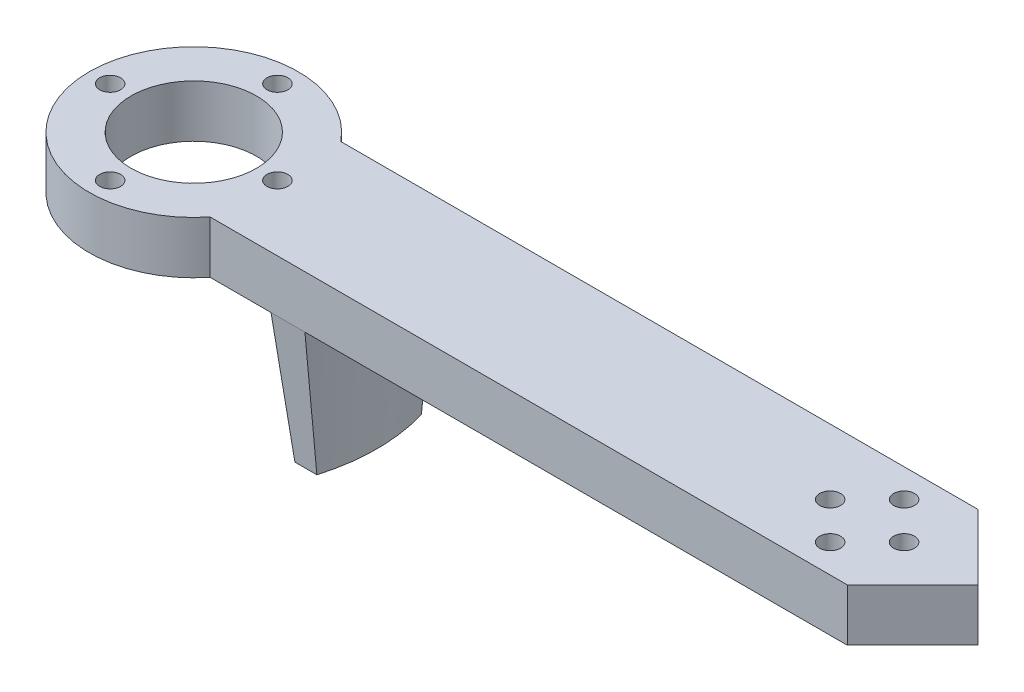
ISO-10303-21;
HEADER;
FILE_DESCRIPTION(('STEP AP214'),'2;1');
FILE_NAME('part.step','',(''),(''),'','','');
FILE_SCHEMA(('AUTOMOTIVE_DESIGN { 1 0 10303 214 1 1 1 1 }'));
ENDSEC;
DATA;
#1=APPLICATION_CONTEXT('core data for automotive mechanical design processes');
#2=APPLICATION_PROTOCOL_DEFINITION('international standard','automotive_design',2000,#1);
#3=PRODUCT_CONTEXT('',#1,'mechanical');
#4=PRODUCT('Part','Part','',(#3));
#5=PRODUCT_RELATED_PRODUCT_CATEGORY('part','',(#4));
#6=PRODUCT_DEFINITION_FORMATION('','',#4);
#7=PRODUCT_DEFINITION_CONTEXT('part definition',#1,'design');
#8=PRODUCT_DEFINITION('design','',#6,#7);
#9=PRODUCT_DEFINITION_SHAPE('','',#8);
#10=(LENGTH_UNIT() NAMED_UNIT(*) SI_UNIT(.MILLI.,.METRE.));
#11=(NAMED_UNIT(*) PLANE_ANGLE_UNIT() SI_UNIT($,.RADIAN.));
#12=(NAMED_UNIT(*) SI_UNIT($,.STERADIAN.) SOLID_ANGLE_UNIT());
#13=UNCERTAINTY_MEASURE_WITH_UNIT(LENGTH_MEASURE(1.E-05),#10,'distance_accuracy_value','');
#14=(GEOMETRIC_REPRESENTATION_CONTEXT(3) GLOBAL_UNCERTAINTY_ASSIGNED_CONTEXT((#13)) GLOBAL_UNIT_ASSIGNED_CONTEXT((#10,
#11,#12)) REPRESENTATION_CONTEXT('',''));
#15=CARTESIAN_POINT('',(0.,0.,0.));
#16=DIRECTION('',(0.,0.,1.));
#17=DIRECTION('',(1.,0.,0.));
#18=AXIS2_PLACEMENT_3D('',#15,#16,#17);
#19=CARTESIAN_POINT('',(0.,0.,0.));
#20=DIRECTION('',(0.,1.,0.));
#21=DIRECTION('',(0.,0.,1.));
#22=AXIS2_PLACEMENT_3D('',#19,#20,#21);
#23=PLANE('',#22);
#24=CARTESIAN_POINT('',(53.7867965644036,0.,7.07106781186549));
#25=DIRECTION('',(0.,1.,0.));
#26=DIRECTION('',(0.,0.,1.));
#27=AXIS2_PLACEMENT_3D('',#24,#25,#26);
#28=CIRCLE('',#27,2.);
#29=CARTESIAN_POINT('',(53.7867965644036,0.,9.07106781186549));
#30=VERTEX_POINT('',#29);
#31=EDGE_CURVE('E232',#30,#30,#28,.T.);
#32=ORIENTED_EDGE('',*,*,#31,.T.);
#33=EDGE_LOOP('',(#32));
#34=FACE_BOUND('',#33,.T.);
#35=CARTESIAN_POINT('',(46.7157287525381,0.,0.));
#36=DIRECTION('',(0.,1.,0.));
#37=DIRECTION('',(0.,0.,1.));
#38=AXIS2_PLACEMENT_3D('',#35,#36,#37);
#39=CIRCLE('',#38,2.);
#40=CARTESIAN_POINT('',(46.7157287525381,0.,2.00000000000002));
#41=VERTEX_POINT('',#40);
#42=EDGE_CURVE('E241',#41,#41,#39,.T.);
#43=ORIENTED_EDGE('',*,*,#42,.T.);
#44=EDGE_LOOP('',(#43));
#45=FACE_BOUND('',#44,.T.);
#46=CARTESIAN_POINT('',(60.8578643762691,0.,0.));
#47=DIRECTION('',(0.,1.,0.));
#48=DIRECTION('',(0.,0.,1.));
#49=AXIS2_PLACEMENT_3D('',#46,#47,#48);
#50=CIRCLE('',#49,1.99999999999997);
#51=CARTESIAN_POINT('',(60.8578643762691,0.,1.99999999999999));
#52=VERTEX_POINT('',#51);
#53=EDGE_CURVE('E249',#52,#52,#50,.T.);
#54=ORIENTED_EDGE('',*,*,#53,.T.);
#55=EDGE_LOOP('',(#54));
#56=FACE_BOUND('',#55,.T.);
#57=CARTESIAN_POINT('',(53.7867965644036,0.,-7.07106781186546));
#58=DIRECTION('',(0.,1.,0.));
#59=DIRECTION('',(0.,0.,1.));
#60=AXIS2_PLACEMENT_3D('',#57,#58,#59);
#61=CIRCLE('',#60,2.);
#62=CARTESIAN_POINT('',(53.7867965644036,0.,-5.07106781186545));
#63=VERTEX_POINT('',#62);
#64=EDGE_CURVE('E257',#63,#63,#61,.T.);
#65=ORIENTED_EDGE('',*,*,#64,.T.);
#66=EDGE_LOOP('',(#65));
#67=FACE_BOUND('',#66,.T.);
#68=DIRECTION('',(1.,0.,0.));
#69=VECTOR('',#68,1.);
#70=CARTESIAN_POINT('',(0.,0.,12.5));
#71=LINE('',#70,#69);
#72=CARTESIAN_POINT('',(-41.2398163512104,0.,12.5));
#73=VERTEX_POINT('',#72);
#74=CARTESIAN_POINT('',(62.5,0.,12.5));
#75=VERTEX_POINT('',#74);
#76=EDGE_CURVE('E173',#73,#75,#71,.T.);
#77=ORIENTED_EDGE('',*,*,#76,.F.);
#78=CARTESIAN_POINT('',(-75.,0.,0.));
#79=DIRECTION('',(0.,1.,0.));
#80=DIRECTION('',(0.,0.,1.));
#81=AXIS2_PLACEMENT_3D('',#78,#79,#80);
#82=CIRCLE('',#81,36.);
#83=CARTESIAN_POINT('',(-41.2398163512104,0.,-12.5));
#84=VERTEX_POINT('',#83);
#85=EDGE_CURVE('E468',#73,#84,#82,.T.);
#86=ORIENTED_EDGE('',*,*,#85,.T.);
#87=DIRECTION('',(1.,0.,0.));
#88=VECTOR('',#87,1.);
#89=CARTESIAN_POINT('',(0.,0.,-12.5));
#90=LINE('',#89,#88);
#91=CARTESIAN_POINT('',(62.5,0.,-12.5));
#92=VERTEX_POINT('',#91);
#93=EDGE_CURVE('E185',#84,#92,#90,.T.);
#94=ORIENTED_EDGE('',*,*,#93,.T.);
#95=DIRECTION('',(0.707106781186548,0.,0.707106781186547));
#96=VECTOR('',#95,1.);
#97=CARTESIAN_POINT('',(37.5,0.,-37.5));
#98=LINE('',#97,#96);
#99=CARTESIAN_POINT('',(75.,0.,0.));
#100=VERTEX_POINT('',#99);
#101=EDGE_CURVE('E190',#92,#100,#98,.T.);
#102=ORIENTED_EDGE('',*,*,#101,.T.);
#103=DIRECTION('',(-0.707106781186547,0.,0.707106781186548));
#104=VECTOR('',#103,1.);
#105=CARTESIAN_POINT('',(37.5,0.,37.5));
#106=LINE('',#105,#104);
#107=EDGE_CURVE('E125',#100,#75,#106,.T.);
#108=ORIENTED_EDGE('',*,*,#107,.T.);
#109=EDGE_LOOP('',(#77,#86,#94,#102,#108));
#110=FACE_BOUND('',#109,.T.);
#111=ADVANCED_FACE('F51',(#34,#45,#56,#67,#110),#23,.F.);
#112=CARTESIAN_POINT('',(-75.,10.,0.));
#113=DIRECTION('',(0.,-1.,0.));
#114=DIRECTION('',(0.,0.,-1.));
#115=AXIS2_PLACEMENT_3D('',#112,#113,#114);
#116=CYLINDRICAL_SURFACE('',#115,20.);
#117=CARTESIAN_POINT('',(-75.,0.,0.));
#118=DIRECTION('',(0.,1.,0.));
#119=DIRECTION('',(0.,0.,1.));
#120=AXIS2_PLACEMENT_3D('',#117,#118,#119);
#121=CIRCLE('',#120,20.);
#122=CARTESIAN_POINT('',(-59.387505004004,0.,-12.5));
#123=VERTEX_POINT('',#122);
#124=CARTESIAN_POINT('',(-59.3875050040041,0.,12.5));
#125=VERTEX_POINT('',#124);
#126=EDGE_CURVE('E170',#123,#125,#121,.T.);
#127=ORIENTED_EDGE('',*,*,#126,.T.);
#128=DIRECTION('',(0.,-1.,0.));
#129=VECTOR('',#128,1.);
#130=CARTESIAN_POINT('',(-59.3875050040041,10.,12.5));
#131=LINE('',#130,#129);
#132=CARTESIAN_POINT('',(-59.3875050040041,10.,12.5));
#133=VERTEX_POINT('',#132);
#134=EDGE_CURVE('E12',#133,#125,#131,.T.);
#135=ORIENTED_EDGE('',*,*,#134,.F.);
#136=CARTESIAN_POINT('',(-75.,10.,0.));
#137=DIRECTION('',(0.,1.,0.));
#138=DIRECTION('',(0.,0.,1.));
#139=AXIS2_PLACEMENT_3D('',#136,#137,#138);
#140=CIRCLE('',#139,20.);
#141=CARTESIAN_POINT('',(-59.387505004004,10.,-12.5));
#142=VERTEX_POINT('',#141);
#143=EDGE_CURVE('E227',#142,#133,#140,.T.);
#144=ORIENTED_EDGE('',*,*,#143,.F.);
#145=DIRECTION('',(0.,-1.,0.));
#146=VECTOR('',#145,1.);
#147=CARTESIAN_POINT('',(-59.387505004004,10.,-12.5));
#148=LINE('',#147,#146);
#149=EDGE_CURVE('E80',#142,#123,#148,.T.);
#150=ORIENTED_EDGE('',*,*,#149,.T.);
#151=EDGE_LOOP('',(#127,#135,#144,#150));
#152=FACE_BOUND('',#151,.T.);
#153=ADVANCED_FACE('F430',(#152),#116,.T.);
#154=CARTESIAN_POINT('',(0.,10.,12.5));
#155=DIRECTION('',(0.,0.,-1.));
#156=DIRECTION('',(-1.,0.,0.));
#157=AXIS2_PLACEMENT_3D('',#154,#155,#156);
#158=PLANE('',#157);
#159=CARTESIAN_POINT('',(-47.7282197134107,0.,12.5));
#160=VERTEX_POINT('',#159);
#161=EDGE_CURVE('E181',#125,#160,#71,.T.);
#162=ORIENTED_EDGE('',*,*,#161,.T.);
#163=DIRECTION('',(1.,0.,0.));
#164=VECTOR('',#163,1.);
#165=CARTESIAN_POINT('',(-47.7282197134108,0.,12.5));
#166=LINE('',#165,#164);
#167=EDGE_CURVE('E70',#160,#73,#166,.T.);
#168=ORIENTED_EDGE('',*,*,#167,.T.);
#169=ORIENTED_EDGE('',*,*,#76,.T.);
#170=DIRECTION('',(0.,-1.,0.));
#171=VECTOR('',#170,1.);
#172=CARTESIAN_POINT('',(62.5,10.,12.5));
#173=LINE('',#172,#171);
#174=CARTESIAN_POINT('',(62.5,10.,12.5));
#175=VERTEX_POINT('',#174);
#176=EDGE_CURVE('E62',#175,#75,#173,.T.);
#177=ORIENTED_EDGE('',*,*,#176,.F.);
#178=DIRECTION('',(1.,0.,0.));
#179=VECTOR('',#178,1.);
#180=CARTESIAN_POINT('',(0.,10.,12.5));
#181=LINE('',#180,#179);
#182=EDGE_CURVE('E110',#133,#175,#181,.T.);
#183=ORIENTED_EDGE('',*,*,#182,.F.);
#184=ORIENTED_EDGE('',*,*,#134,.T.);
#185=EDGE_LOOP('',(#162,#168,#169,#177,#183,#184));
#186=FACE_BOUND('',#185,.T.);
#187=ADVANCED_FACE('F437',(#186),#158,.F.);
#188=CARTESIAN_POINT('',(37.5,10.,37.5));
#189=DIRECTION('',(0.707106781186548,0.,0.707106781186547));
#190=DIRECTION('',(0.707106781186547,0.,-0.707106781186548));
#191=AXIS2_PLACEMENT_3D('',#188,#189,#190);
#192=PLANE('',#191);
#193=ORIENTED_EDGE('',*,*,#107,.F.);
#194=DIRECTION('',(0.,-1.,0.));
#195=VECTOR('',#194,1.);
#196=CARTESIAN_POINT('',(75.,10.,0.));
#197=LINE('',#196,#195);
#198=CARTESIAN_POINT('',(75.,10.,0.));
#199=VERTEX_POINT('',#198);
#200=EDGE_CURVE('E119',#199,#100,#197,.T.);
#201=ORIENTED_EDGE('',*,*,#200,.F.);
#202=DIRECTION('',(-0.707106781186547,0.,0.707106781186548));
#203=VECTOR('',#202,1.);
#204=CARTESIAN_POINT('',(37.5,10.,37.5));
#205=LINE('',#204,#203);
#206=EDGE_CURVE('E123',#199,#175,#205,.T.);
#207=ORIENTED_EDGE('',*,*,#206,.T.);
#208=ORIENTED_EDGE('',*,*,#176,.T.);
#209=EDGE_LOOP('',(#193,#201,#207,#208));
#210=FACE_BOUND('',#209,.T.);
#211=ADVANCED_FACE('F121',(#210),#192,.T.);
#212=CARTESIAN_POINT('',(37.5,10.,-37.5));
#213=DIRECTION('',(0.707106781186547,0.,-0.707106781186548));
#214=DIRECTION('',(-0.707106781186548,0.,-0.707106781186547));
#215=AXIS2_PLACEMENT_3D('',#212,#213,#214);
#216=PLANE('',#215);
#217=ORIENTED_EDGE('',*,*,#101,.F.);
#218=DIRECTION('',(0.,-1.,0.));
#219=VECTOR('',#218,1.);
#220=CARTESIAN_POINT('',(62.5,10.,-12.5));
#221=LINE('',#220,#219);
#222=CARTESIAN_POINT('',(62.5,10.,-12.5));
#223=VERTEX_POINT('',#222);
#224=EDGE_CURVE('E131',#223,#92,#221,.T.);
#225=ORIENTED_EDGE('',*,*,#224,.F.);
#226=DIRECTION('',(0.707106781186548,0.,0.707106781186547));
#227=VECTOR('',#226,1.);
#228=CARTESIAN_POINT('',(37.5,10.,-37.5));
#229=LINE('',#228,#227);
#230=EDGE_CURVE('E137',#223,#199,#229,.T.);
#231=ORIENTED_EDGE('',*,*,#230,.T.);
#232=ORIENTED_EDGE('',*,*,#200,.T.);
#233=EDGE_LOOP('',(#217,#225,#231,#232));
#234=FACE_BOUND('',#233,.T.);
#235=ADVANCED_FACE('F140',(#234),#216,.T.);
#236=CARTESIAN_POINT('',(-75.,10.,-16.));
#237=DIRECTION('',(0.,-1.,0.));
#238=DIRECTION('',(0.,0.,-1.));
#239=AXIS2_PLACEMENT_3D('',#236,#237,#238);
#240=CYLINDRICAL_SURFACE('',#239,2.);
#241=CARTESIAN_POINT('',(-75.,10.,-16.));
#242=DIRECTION('',(0.,1.,0.));
#243=DIRECTION('',(0.,0.,1.));
#244=AXIS2_PLACEMENT_3D('',#241,#242,#243);
#245=CIRCLE('',#244,2.);
#246=CARTESIAN_POINT('',(-75.,10.,-14.));
#247=VERTEX_POINT('',#246);
#248=EDGE_CURVE('E223',#247,#247,#245,.T.);
#249=ORIENTED_EDGE('',*,*,#248,.T.);
#250=EDGE_LOOP('',(#249));
#251=FACE_BOUND('',#250,.T.);
#252=CARTESIAN_POINT('',(-75.,0.,-16.));
#253=DIRECTION('',(0.,1.,0.));
#254=DIRECTION('',(0.,0.,1.));
#255=AXIS2_PLACEMENT_3D('',#252,#253,#254);
#256=CIRCLE('',#255,2.);
#257=CARTESIAN_POINT('',(-75.,0.,-14.));
#258=VERTEX_POINT('',#257);
#259=EDGE_CURVE('E166',#258,#258,#256,.T.);
#260=ORIENTED_EDGE('',*,*,#259,.F.);
#261=EDGE_LOOP('',(#260));
#262=FACE_BOUND('',#261,.T.);
#263=ADVANCED_FACE('F484',(#251,#262),#240,.F.);
#264=CARTESIAN_POINT('',(-59.,10.,0.));
#265=DIRECTION('',(0.,-1.,0.));
#266=DIRECTION('',(0.,0.,-1.));
#267=AXIS2_PLACEMENT_3D('',#264,#265,#266);
#268=CYLINDRICAL_SURFACE('',#267,2.);
#269=CARTESIAN_POINT('',(-59.,10.,0.));
#270=DIRECTION('',(0.,1.,0.));
#271=DIRECTION('',(0.,0.,1.));
#272=AXIS2_PLACEMENT_3D('',#269,#270,#271);
#273=CIRCLE('',#272,2.);
#274=CARTESIAN_POINT('',(-59.,10.,1.99999999999999));
#275=VERTEX_POINT('',#274);
#276=EDGE_CURVE('E219',#275,#275,#273,.T.);
#277=ORIENTED_EDGE('',*,*,#276,.T.);
#278=EDGE_LOOP('',(#277));
#279=FACE_BOUND('',#278,.T.);
#280=CARTESIAN_POINT('',(-59.,0.,0.));
#281=DIRECTION('',(0.,1.,0.));
#282=DIRECTION('',(0.,0.,1.));
#283=AXIS2_PLACEMENT_3D('',#280,#281,#282);
#284=CIRCLE('',#283,2.);
#285=CARTESIAN_POINT('',(-59.,0.,1.99999999999999));
#286=VERTEX_POINT('',#285);
#287=EDGE_CURVE('E162',#286,#286,#284,.T.);
#288=ORIENTED_EDGE('',*,*,#287,.F.);
#289=EDGE_LOOP('',(#288));
#290=FACE_BOUND('',#289,.T.);
#291=ADVANCED_FACE('F514',(#279,#290),#268,.F.);
#292=CARTESIAN_POINT('',(-91.,10.,0.));
#293=DIRECTION('',(0.,-1.,0.));
#294=DIRECTION('',(0.,0.,-1.));
#295=AXIS2_PLACEMENT_3D('',#292,#293,#294);
#296=CYLINDRICAL_SURFACE('',#295,2.);
#297=CARTESIAN_POINT('',(-91.,10.,0.));
#298=DIRECTION('',(0.,1.,0.));
#299=DIRECTION('',(0.,0.,1.));
#300=AXIS2_PLACEMENT_3D('',#297,#298,#299);
#301=CIRCLE('',#300,2.);
#302=CARTESIAN_POINT('',(-91.,10.,1.99999999999999));
#303=VERTEX_POINT('',#302);
#304=EDGE_CURVE('E215',#303,#303,#301,.T.);
#305=ORIENTED_EDGE('',*,*,#304,.T.);
#306=EDGE_LOOP('',(#305));
#307=FACE_BOUND('',#306,.T.);
#308=CARTESIAN_POINT('',(-91.,0.,0.));
#309=DIRECTION('',(0.,1.,0.));
#310=DIRECTION('',(0.,0.,1.));
#311=AXIS2_PLACEMENT_3D('',#308,#309,#310);
#312=CIRCLE('',#311,2.);
#313=CARTESIAN_POINT('',(-91.,0.,1.99999999999999));
#314=VERTEX_POINT('',#313);
#315=EDGE_CURVE('E158',#314,#314,#312,.T.);
#316=ORIENTED_EDGE('',*,*,#315,.F.);
#317=EDGE_LOOP('',(#316));
#318=FACE_BOUND('',#317,.T.);
#319=ADVANCED_FACE('F518',(#307,#318),#296,.F.);
#320=CARTESIAN_POINT('',(-75.,10.,16.));
#321=DIRECTION('',(0.,-1.,0.));
#322=DIRECTION('',(0.,0.,-1.));
#323=AXIS2_PLACEMENT_3D('',#320,#321,#322);
#324=CYLINDRICAL_SURFACE('',#323,2.);
#325=CARTESIAN_POINT('',(-75.,10.,16.));
#326=DIRECTION('',(0.,1.,0.));
#327=DIRECTION('',(0.,0.,1.));
#328=AXIS2_PLACEMENT_3D('',#325,#326,#327);
#329=CIRCLE('',#328,2.);
#330=CARTESIAN_POINT('',(-75.,10.,18.));
#331=VERTEX_POINT('',#330);
#332=EDGE_CURVE('E211',#331,#331,#329,.T.);
#333=ORIENTED_EDGE('',*,*,#332,.T.);
#334=EDGE_LOOP('',(#333));
#335=FACE_BOUND('',#334,.T.);
#336=CARTESIAN_POINT('',(-75.,0.,16.));
#337=DIRECTION('',(0.,1.,0.));
#338=DIRECTION('',(0.,0.,1.));
#339=AXIS2_PLACEMENT_3D('',#336,#337,#338);
#340=CIRCLE('',#339,2.);
#341=CARTESIAN_POINT('',(-75.,0.,18.));
#342=VERTEX_POINT('',#341);
#343=EDGE_CURVE('E153',#342,#342,#340,.T.);
#344=ORIENTED_EDGE('',*,*,#343,.F.);
#345=EDGE_LOOP('',(#344));
#346=FACE_BOUND('',#345,.T.);
#347=ADVANCED_FACE('F521',(#335,#346),#324,.F.);
#348=CARTESIAN_POINT('',(-75.,10.,0.));
#349=DIRECTION('',(0.,-1.,0.));
#350=DIRECTION('',(0.,0.,-1.));
#351=AXIS2_PLACEMENT_3D('',#348,#349,#350);
#352=CYLINDRICAL_SURFACE('',#351,12.);
#353=CARTESIAN_POINT('',(-75.,10.,0.));
#354=DIRECTION('',(0.,1.,0.));
#355=DIRECTION('',(0.,0.,1.));
#356=AXIS2_PLACEMENT_3D('',#353,#354,#355);
#357=CIRCLE('',#356,12.);
#358=CARTESIAN_POINT('',(-75.,10.,12.));
#359=VERTEX_POINT('',#358);
#360=EDGE_CURVE('E208',#359,#359,#357,.T.);
#361=ORIENTED_EDGE('',*,*,#360,.T.);
#362=EDGE_LOOP('',(#361));
#363=FACE_BOUND('',#362,.T.);
#364=CARTESIAN_POINT('',(-75.,0.,0.));
#365=DIRECTION('',(0.,1.,0.));
#366=DIRECTION('',(0.,0.,1.));
#367=AXIS2_PLACEMENT_3D('',#364,#365,#366);
#368=CIRCLE('',#367,12.);
#369=CARTESIAN_POINT('',(-75.,0.,12.));
#370=VERTEX_POINT('',#369);
#371=EDGE_CURVE('E149',#370,#370,#368,.T.);
#372=ORIENTED_EDGE('',*,*,#371,.F.);
#373=EDGE_LOOP('',(#372));
#374=FACE_BOUND('',#373,.T.);
#375=ADVANCED_FACE('F53',(#363,#374),#352,.F.);
#376=CARTESIAN_POINT('',(0.,10.,-12.5));
#377=DIRECTION('',(0.,0.,-1.));
#378=DIRECTION('',(-1.,0.,0.));
#379=AXIS2_PLACEMENT_3D('',#376,#377,#378);
#380=PLANE('',#379);
#381=CARTESIAN_POINT('',(-47.7282197134107,0.,-12.5));
#382=VERTEX_POINT('',#381);
#383=EDGE_CURVE('E189',#123,#382,#90,.T.);
#384=ORIENTED_EDGE('',*,*,#383,.F.);
#385=ORIENTED_EDGE('',*,*,#149,.F.);
#386=DIRECTION('',(1.,0.,0.));
#387=VECTOR('',#386,1.);
#388=CARTESIAN_POINT('',(0.,10.,-12.5));
#389=LINE('',#388,#387);
#390=EDGE_CURVE('E143',#142,#223,#389,.T.);
#391=ORIENTED_EDGE('',*,*,#390,.T.);
#392=ORIENTED_EDGE('',*,*,#224,.T.);
#393=ORIENTED_EDGE('',*,*,#93,.F.);
#394=DIRECTION('',(-1.,0.,0.));
#395=VECTOR('',#394,1.);
#396=CARTESIAN_POINT('',(-41.2398163512104,0.,-12.5));
#397=LINE('',#396,#395);
#398=EDGE_CURVE('E55',#84,#382,#397,.T.);
#399=ORIENTED_EDGE('',*,*,#398,.T.);
#400=EDGE_LOOP('',(#384,#385,#391,#392,#393,#399));
#401=FACE_BOUND('',#400,.T.);
#402=ADVANCED_FACE('F452',(#401),#380,.T.);
#403=CARTESIAN_POINT('',(0.,10.,0.));
#404=DIRECTION('',(0.,1.,0.));
#405=DIRECTION('',(0.,0.,1.));
#406=AXIS2_PLACEMENT_3D('',#403,#404,#405);
#407=PLANE('',#406);
#408=CARTESIAN_POINT('',(53.7867965644036,10.,-7.07106781186546));
#409=DIRECTION('',(0.,1.,0.));
#410=DIRECTION('',(0.,0.,1.));
#411=AXIS2_PLACEMENT_3D('',#408,#409,#410);
#412=CIRCLE('',#411,2.);
#413=CARTESIAN_POINT('',(53.7867965644036,10.,-5.07106781186545));
#414=VERTEX_POINT('',#413);
#415=EDGE_CURVE('E154',#414,#414,#412,.T.);
#416=ORIENTED_EDGE('',*,*,#415,.F.);
#417=EDGE_LOOP('',(#416));
#418=FACE_BOUND('',#417,.T.);
#419=CARTESIAN_POINT('',(60.8578643762691,10.,0.));
#420=DIRECTION('',(0.,1.,0.));
#421=DIRECTION('',(0.,0.,1.));
#422=AXIS2_PLACEMENT_3D('',#419,#420,#421);
#423=CIRCLE('',#422,1.99999999999997);
#424=CARTESIAN_POINT('',(60.8578643762691,10.,1.99999999999999));
#425=VERTEX_POINT('',#424);
#426=EDGE_CURVE('E253',#425,#425,#423,.T.);
#427=ORIENTED_EDGE('',*,*,#426,.F.);
#428=EDGE_LOOP('',(#427));
#429=FACE_BOUND('',#428,.T.);
#430=CARTESIAN_POINT('',(46.7157287525381,10.,0.));
#431=DIRECTION('',(0.,1.,0.));
#432=DIRECTION('',(0.,0.,1.));
#433=AXIS2_PLACEMENT_3D('',#430,#431,#432);
#434=CIRCLE('',#433,2.);
#435=CARTESIAN_POINT('',(46.7157287525381,10.,2.00000000000002));
#436=VERTEX_POINT('',#435);
#437=EDGE_CURVE('E245',#436,#436,#434,.T.);
#438=ORIENTED_EDGE('',*,*,#437,.F.);
#439=EDGE_LOOP('',(#438));
#440=FACE_BOUND('',#439,.T.);
#441=CARTESIAN_POINT('',(53.7867965644036,10.,7.07106781186549));
#442=DIRECTION('',(0.,1.,0.));
#443=DIRECTION('',(0.,0.,1.));
#444=AXIS2_PLACEMENT_3D('',#441,#442,#443);
#445=CIRCLE('',#444,2.);
#446=CARTESIAN_POINT('',(53.7867965644036,10.,9.07106781186549));
#447=VERTEX_POINT('',#446);
#448=EDGE_CURVE('E236',#447,#447,#445,.T.);
#449=ORIENTED_EDGE('',*,*,#448,.F.);
#450=EDGE_LOOP('',(#449));
#451=FACE_BOUND('',#450,.T.);
#452=ORIENTED_EDGE('',*,*,#360,.F.);
#453=EDGE_LOOP('',(#452));
#454=FACE_BOUND('',#453,.T.);
#455=ORIENTED_EDGE('',*,*,#332,.F.);
#456=EDGE_LOOP('',(#455));
#457=FACE_BOUND('',#456,.T.);
#458=ORIENTED_EDGE('',*,*,#304,.F.);
#459=EDGE_LOOP('',(#458));
#460=FACE_BOUND('',#459,.T.);
#461=ORIENTED_EDGE('',*,*,#276,.F.);
#462=EDGE_LOOP('',(#461));
#463=FACE_BOUND('',#462,.T.);
#464=ORIENTED_EDGE('',*,*,#248,.F.);
#465=EDGE_LOOP('',(#464));
#466=FACE_BOUND('',#465,.T.);
#467=ORIENTED_EDGE('',*,*,#143,.T.);
#468=ORIENTED_EDGE('',*,*,#182,.T.);
#469=ORIENTED_EDGE('',*,*,#206,.F.);
#470=ORIENTED_EDGE('',*,*,#230,.F.);
#471=ORIENTED_EDGE('',*,*,#390,.F.);
#472=EDGE_LOOP('',(#467,#468,#469,#470,#471));
#473=FACE_BOUND('',#472,.T.);
#474=ADVANCED_FACE('F135',(#418,#429,#440,#451,#454,#457,#460,#463,#466,#473),#407,.T.);
#475=ORIENTED_EDGE('',*,*,#371,.T.);
#476=EDGE_LOOP('',(#475));
#477=FACE_BOUND('',#476,.T.);
#478=ORIENTED_EDGE('',*,*,#343,.T.);
#479=EDGE_LOOP('',(#478));
#480=FACE_BOUND('',#479,.T.);
#481=ORIENTED_EDGE('',*,*,#315,.T.);
#482=EDGE_LOOP('',(#481));
#483=FACE_BOUND('',#482,.T.);
#484=ORIENTED_EDGE('',*,*,#287,.T.);
#485=EDGE_LOOP('',(#484));
#486=FACE_BOUND('',#485,.T.);
#487=ORIENTED_EDGE('',*,*,#259,.T.);
#488=EDGE_LOOP('',(#487));
#489=FACE_BOUND('',#488,.T.);
#490=ORIENTED_EDGE('',*,*,#383,.T.);
#491=CARTESIAN_POINT('',(-75.,0.,0.));
#492=DIRECTION('',(0.,-1.,0.));
#493=DIRECTION('',(0.,0.,1.));
#494=AXIS2_PLACEMENT_3D('',#491,#492,#493);
#495=CIRCLE('',#494,30.);
#496=EDGE_CURVE('E464',#382,#160,#495,.T.);
#497=ORIENTED_EDGE('',*,*,#496,.T.);
#498=ORIENTED_EDGE('',*,*,#161,.F.);
#499=ORIENTED_EDGE('',*,*,#126,.F.);
#500=EDGE_LOOP('',(#490,#497,#498,#499));
#501=FACE_BOUND('',#500,.T.);
#502=ADVANCED_FACE('F433',(#477,#480,#483,#486,#489,#501),#23,.F.);
#503=CARTESIAN_POINT('',(53.7867965644036,10.,7.07106781186549));
#504=DIRECTION('',(0.,-1.,0.));
#505=DIRECTION('',(0.,0.,-1.));
#506=AXIS2_PLACEMENT_3D('',#503,#504,#505);
#507=CYLINDRICAL_SURFACE('',#506,2.);
#508=ORIENTED_EDGE('',*,*,#448,.T.);
#509=EDGE_LOOP('',(#508));
#510=FACE_BOUND('',#509,.T.);
#511=ORIENTED_EDGE('',*,*,#31,.F.);
#512=EDGE_LOOP('',(#511));
#513=FACE_BOUND('',#512,.T.);
#514=ADVANCED_FACE('F443',(#510,#513),#507,.F.);
#515=CARTESIAN_POINT('',(46.7157287525381,10.,0.));
#516=DIRECTION('',(0.,-1.,0.));
#517=DIRECTION('',(0.,0.,-1.));
#518=AXIS2_PLACEMENT_3D('',#515,#516,#517);
#519=CYLINDRICAL_SURFACE('',#518,2.);
#520=ORIENTED_EDGE('',*,*,#437,.T.);
#521=EDGE_LOOP('',(#520));
#522=FACE_BOUND('',#521,.T.);
#523=ORIENTED_EDGE('',*,*,#42,.F.);
#524=EDGE_LOOP('',(#523));
#525=FACE_BOUND('',#524,.T.);
#526=ADVANCED_FACE('F449',(#522,#525),#519,.F.);
#527=CARTESIAN_POINT('',(60.8578643762691,10.,0.));
#528=DIRECTION('',(0.,-1.,0.));
#529=DIRECTION('',(0.,0.,-1.));
#530=AXIS2_PLACEMENT_3D('',#527,#528,#529);
#531=CYLINDRICAL_SURFACE('',#530,1.99999999999997);
#532=ORIENTED_EDGE('',*,*,#426,.T.);
#533=EDGE_LOOP('',(#532));
#534=FACE_BOUND('',#533,.T.);
#535=ORIENTED_EDGE('',*,*,#53,.F.);
#536=EDGE_LOOP('',(#535));
#537=FACE_BOUND('',#536,.T.);
#538=ADVANCED_FACE('F573',(#534,#537),#531,.F.);
#539=CARTESIAN_POINT('',(53.7867965644036,10.,-7.07106781186546));
#540=DIRECTION('',(0.,-1.,0.));
#541=DIRECTION('',(0.,0.,-1.));
#542=AXIS2_PLACEMENT_3D('',#539,#540,#541);
#543=CYLINDRICAL_SURFACE('',#542,2.);
#544=ORIENTED_EDGE('',*,*,#415,.T.);
#545=EDGE_LOOP('',(#544));
#546=FACE_BOUND('',#545,.T.);
#547=ORIENTED_EDGE('',*,*,#64,.F.);
#548=EDGE_LOOP('',(#547));
#549=FACE_BOUND('',#548,.T.);
#550=ADVANCED_FACE('F281',(#546,#549),#543,.F.);
#551=CARTESIAN_POINT('',(-75.,-25.,0.));
#552=DIRECTION('',(0.,1.,0.));
#553=DIRECTION('',(0.,0.,1.));
#554=AXIS2_PLACEMENT_3D('',#551,#552,#553);
#555=PLANE('',#554);
#556=CARTESIAN_POINT('',(-75.,-25.,0.));
#557=DIRECTION('',(0.,1.,0.));
#558=DIRECTION('',(0.,0.,1.));
#559=AXIS2_PLACEMENT_3D('',#556,#557,#558);
#560=CIRCLE('',#559,35.);
#561=CARTESIAN_POINT('',(-41.4589803375032,-25.,10.));
#562=VERTEX_POINT('',#561);
#563=CARTESIAN_POINT('',(-41.4589803375032,-25.,-10.));
#564=VERTEX_POINT('',#563);
#565=EDGE_CURVE('E315',#562,#564,#560,.T.);
#566=ORIENTED_EDGE('',*,*,#565,.F.);
#567=DIRECTION('',(1.,0.,0.));
#568=VECTOR('',#567,1.);
#569=CARTESIAN_POINT('',(-45.6571984977576,-25.,9.99999999999998));
#570=LINE('',#569,#568);
#571=CARTESIAN_POINT('',(-45.6571984977576,-25.,9.99999999999998));
#572=VERTEX_POINT('',#571);
#573=EDGE_CURVE('E237',#572,#562,#570,.T.);
#574=ORIENTED_EDGE('',*,*,#573,.F.);
#575=CARTESIAN_POINT('',(-75.,-25.,0.));
#576=DIRECTION('',(0.,-1.,0.));
#577=DIRECTION('',(0.,0.,1.));
#578=AXIS2_PLACEMENT_3D('',#575,#576,#577);
#579=CIRCLE('',#578,31.);
#580=CARTESIAN_POINT('',(-45.6571984977576,-25.,-10.));
#581=VERTEX_POINT('',#580);
#582=EDGE_CURVE('E314',#581,#572,#579,.T.);
#583=ORIENTED_EDGE('',*,*,#582,.F.);
#584=DIRECTION('',(-1.,0.,0.));
#585=VECTOR('',#584,1.);
#586=CARTESIAN_POINT('',(-45.6571984977576,-25.,-10.));
#587=LINE('',#586,#585);
#588=EDGE_CURVE('E306',#564,#581,#587,.T.);
#589=ORIENTED_EDGE('',*,*,#588,.F.);
#590=EDGE_LOOP('',(#566,#574,#583,#589));
#591=FACE_BOUND('',#590,.T.);
#592=ADVANCED_FACE('F270',(#591),#555,.F.);
#593=CARTESIAN_POINT('',(0.,-1.23762376237622,-12.3762376237621));
#594=DIRECTION('',(0.,-0.0995037190209994,-0.995037190209989));
#595=DIRECTION('',(0.,0.995037190209989,-0.0995037190209994));
#596=AXIS2_PLACEMENT_3D('',#593,#594,#595);
#597=PLANE('',#596);
#598=DIRECTION('',(-0.00872272082784853,-0.994999335360422,0.0994999335360427));
#599=VECTOR('',#598,1.);
#600=CARTESIAN_POINT('',(-41.2398163512104,0.,-12.5));
#601=LINE('',#600,#599);
#602=EDGE_CURVE('E367',#84,#564,#601,.T.);
#603=ORIENTED_EDGE('',*,*,#602,.T.);
#604=ORIENTED_EDGE('',*,*,#588,.T.);
#605=DIRECTION('',(0.0821511033438722,-0.991673850597961,0.0991673850597954));
#606=VECTOR('',#605,1.);
#607=CARTESIAN_POINT('',(-47.7282197134107,0.,-12.5));
#608=LINE('',#607,#606);
#609=EDGE_CURVE('E348',#382,#581,#608,.T.);
#610=ORIENTED_EDGE('',*,*,#609,.F.);
#611=ORIENTED_EDGE('',*,*,#398,.F.);
#612=EDGE_LOOP('',(#603,#604,#610,#611));
#613=FACE_BOUND('',#612,.T.);
#614=ADVANCED_FACE('F280',(#613),#597,.T.);
#615=CARTESIAN_POINT('',(-47.7282197134107,0.,12.5));
#616=CARTESIAN_POINT('',(-45.6571984977576,-25.,9.99999999999997));
#617=CARTESIAN_POINT('',(-44.0319003499802,0.,4.43558323611662));
#618=CARTESIAN_POINT('',(-43.4271861735945,-25.,3.45651910245275));
#619=CARTESIAN_POINT('',(-44.0319003499802,0.,-4.43558323611663));
#620=CARTESIAN_POINT('',(-43.4271861735945,-25.,-3.45651910245285));
#621=CARTESIAN_POINT('',(-47.7282197134108,0.,-12.5));
#622=CARTESIAN_POINT('',(-45.6571984977576,-25.,-10.0000000000001));
#623=(BOUNDED_SURFACE() B_SPLINE_SURFACE(3,1,((#615,#616),(#617,#618),(#619,#620),(#621,#622)),
.UNSPECIFIED.,.F.,.F.,.F.) B_SPLINE_SURFACE_WITH_KNOTS((4,4),(2,2),(0.,1.),(0.,1.),
.UNSPECIFIED.) GEOMETRIC_REPRESENTATION_ITEM() RATIONAL_B_SPLINE_SURFACE(((1.,1.),
(0.939372895257539,0.964361322628869),(0.939372895257539,0.964361322628869),(1.,1.))) REPRESENTATION_ITEM('') SURFACE());
#624=DIRECTION('',(0.0821511033438738,-0.99167385059796,-0.0991673850597989));
#625=VECTOR('',#624,1.);
#626=CARTESIAN_POINT('',(-47.7282197134108,0.,12.5));
#627=LINE('',#626,#625);
#628=EDGE_CURVE('E332',#160,#572,#627,.T.);
#629=ORIENTED_EDGE('',*,*,#496,.F.);
#630=ORIENTED_EDGE('',*,*,#609,.T.);
#631=ORIENTED_EDGE('',*,*,#582,.T.);
#632=ORIENTED_EDGE('',*,*,#628,.F.);
#633=EDGE_LOOP('',(#629,#630,#631,#632));
#634=FACE_BOUND('',#633,.T.);
#635=ADVANCED_FACE('F345',(#634),#623,.T.);
#636=CARTESIAN_POINT('',(-41.2398163512104,0.,-12.5));
#637=CARTESIAN_POINT('',(-41.4589803375032,-25.,-10.));
#638=CARTESIAN_POINT('',(-38.2210867218836,0.,-4.34697066623066));
#639=CARTESIAN_POINT('',(-39.4997718291066,-25.,-3.42861488969399));
#640=CARTESIAN_POINT('',(-38.2210867218836,0.,4.34697066623068));
#641=CARTESIAN_POINT('',(-39.4997718291066,-25.,3.42861488969398));
#642=CARTESIAN_POINT('',(-41.2398163512104,0.,12.5));
#643=CARTESIAN_POINT('',(-41.4589803375032,-25.,10.));
#644=(BOUNDED_SURFACE() B_SPLINE_SURFACE(3,1,((#636,#637),(#638,#639),(#640,#641),(#642,#643)),
.UNSPECIFIED.,.F.,.F.,.F.) B_SPLINE_SURFACE_WITH_KNOTS((4,4),(2,2),(0.,1.),(0.,1.),
.UNSPECIFIED.) GEOMETRIC_REPRESENTATION_ITEM() RATIONAL_B_SPLINE_SURFACE(((1.,1.),
(0.958521919422029,0.972209898333273),(0.958521919422029,0.972209898333273),(1.,1.))) REPRESENTATION_ITEM('') SURFACE());
#645=DIRECTION('',(-0.00872272082784826,-0.994999335360422,-0.0994999335360437));
#646=VECTOR('',#645,1.);
#647=CARTESIAN_POINT('',(-41.3493983443568,-12.5,11.25));
#648=LINE('',#647,#646);
#649=EDGE_CURVE('E352',#73,#562,#648,.T.);
#650=ORIENTED_EDGE('',*,*,#85,.F.);
#651=ORIENTED_EDGE('',*,*,#649,.T.);
#652=ORIENTED_EDGE('',*,*,#565,.T.);
#653=ORIENTED_EDGE('',*,*,#602,.F.);
#654=EDGE_LOOP('',(#650,#651,#652,#653));
#655=FACE_BOUND('',#654,.T.);
#656=ADVANCED_FACE('F409',(#655),#644,.T.);
#657=CARTESIAN_POINT('',(0.,-1.23762376237632,12.3762376237628));
#658=DIRECTION('',(0.,-0.0995037190210023,0.995037190209989));
#659=DIRECTION('',(0.,-0.995037190209989,-0.0995037190210023));
#660=AXIS2_PLACEMENT_3D('',#657,#658,#659);
#661=PLANE('',#660);
#662=ORIENTED_EDGE('',*,*,#628,.T.);
#663=ORIENTED_EDGE('',*,*,#573,.T.);
#664=ORIENTED_EDGE('',*,*,#649,.F.);
#665=ORIENTED_EDGE('',*,*,#167,.F.);
#666=EDGE_LOOP('',(#662,#663,#664,#665));
#667=FACE_BOUND('',#666,.T.);
#668=ADVANCED_FACE('F283',(#667),#661,.T.);
#669=CLOSED_SHELL('',(#111,#153,#187,#211,#235,#263,#291,#319,#347,#375,#402,#474,#502,#514,
#526,#538,#550,#592,#614,#635,#656,#668));
#670=MANIFOLD_SOLID_BREP('B2',#669);
#671=ADVANCED_BREP_SHAPE_REPRESENTATION('',(#18,#670),#14);
#672=SHAPE_DEFINITION_REPRESENTATION(#9,#671);
ENDSEC;
END-ISO-10303-21;
